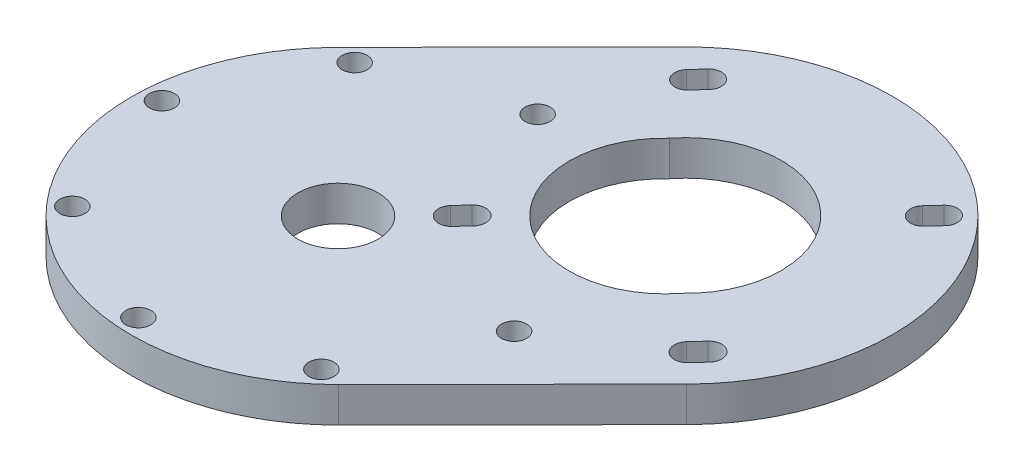
ISO-10303-21;
HEADER;
FILE_DESCRIPTION(('STEP AP214'),'2;1');
FILE_NAME('part.step','',(''),(''),'','','');
FILE_SCHEMA(('AUTOMOTIVE_DESIGN { 1 0 10303 214 1 1 1 1 }'));
ENDSEC;
DATA;
#1=APPLICATION_CONTEXT('core data for automotive mechanical design processes');
#2=APPLICATION_PROTOCOL_DEFINITION('international standard','automotive_design',2000,#1);
#3=PRODUCT_CONTEXT('',#1,'mechanical');
#4=PRODUCT('Part','Part','',(#3));
#5=PRODUCT_RELATED_PRODUCT_CATEGORY('part','',(#4));
#6=PRODUCT_DEFINITION_FORMATION('','',#4);
#7=PRODUCT_DEFINITION_CONTEXT('part definition',#1,'design');
#8=PRODUCT_DEFINITION('design','',#6,#7);
#9=PRODUCT_DEFINITION_SHAPE('','',#8);
#10=(LENGTH_UNIT() NAMED_UNIT(*) SI_UNIT(.MILLI.,.METRE.));
#11=(NAMED_UNIT(*) PLANE_ANGLE_UNIT() SI_UNIT($,.RADIAN.));
#12=(NAMED_UNIT(*) SI_UNIT($,.STERADIAN.) SOLID_ANGLE_UNIT());
#13=UNCERTAINTY_MEASURE_WITH_UNIT(LENGTH_MEASURE(1.E-05),#10,'distance_accuracy_value','');
#14=(GEOMETRIC_REPRESENTATION_CONTEXT(3) GLOBAL_UNCERTAINTY_ASSIGNED_CONTEXT((#13)) GLOBAL_UNIT_ASSIGNED_CONTEXT((#10,
#11,#12)) REPRESENTATION_CONTEXT('',''));
#15=CARTESIAN_POINT('',(0.,0.,0.));
#16=DIRECTION('',(0.,0.,1.));
#17=DIRECTION('',(1.,0.,0.));
#18=AXIS2_PLACEMENT_3D('',#15,#16,#17);
#19=CARTESIAN_POINT('',(48.6119055217946,7.,48.3782656438902));
#20=DIRECTION('',(-0.708808076030817,0.,-0.705401383152522));
#21=DIRECTION('',(-0.705401383152522,0.,0.708808076030817));
#22=AXIS2_PLACEMENT_3D('',#19,#20,#21);
#23=PLANE('',#22);
#24=DIRECTION('',(0.705401383152522,0.,-0.708808076030817));
#25=VECTOR('',#24,1.);
#26=CARTESIAN_POINT('',(48.6119055217946,0.,48.3782656438902));
#27=LINE('',#26,#25);
#28=CARTESIAN_POINT('',(57.4856721403524,0.,39.4616437116556));
#29=VERTEX_POINT('',#28);
#30=CARTESIAN_POINT('',(92.06950406204,0.,4.71079128685355));
#31=VERTEX_POINT('',#30);
#32=EDGE_CURVE('E308',#29,#31,#27,.T.);
#33=ORIENTED_EDGE('',*,*,#32,.T.);
#34=DIRECTION('',(0.,-1.,0.));
#35=VECTOR('',#34,1.);
#36=CARTESIAN_POINT('',(92.06950406204,7.,4.71079128685355));
#37=LINE('',#36,#35);
#38=CARTESIAN_POINT('',(92.06950406204,7.,4.71079128685355));
#39=VERTEX_POINT('',#38);
#40=EDGE_CURVE('E11',#39,#31,#37,.T.);
#41=ORIENTED_EDGE('',*,*,#40,.F.);
#42=DIRECTION('',(0.705401383152522,0.,-0.708808076030817));
#43=VECTOR('',#42,1.);
#44=CARTESIAN_POINT('',(48.6119055217946,7.,48.3782656438902));
#45=LINE('',#44,#43);
#46=CARTESIAN_POINT('',(57.4856721403524,7.,39.4616437116556));
#47=VERTEX_POINT('',#46);
#48=EDGE_CURVE('E210',#47,#39,#45,.T.);
#49=ORIENTED_EDGE('',*,*,#48,.F.);
#50=DIRECTION('',(0.,-1.,0.));
#51=VECTOR('',#50,1.);
#52=CARTESIAN_POINT('',(57.4856721403524,7.,39.4616437116556));
#53=LINE('',#52,#51);
#54=EDGE_CURVE('E320',#47,#29,#53,.T.);
#55=ORIENTED_EDGE('',*,*,#54,.T.);
#56=EDGE_LOOP('',(#33,#41,#49,#55));
#57=FACE_BOUND('',#56,.T.);
#58=ADVANCED_FACE('F47',(#57),#23,.F.);
#59=CARTESIAN_POINT('',(62.9088785904308,7.,-24.309681584242));
#60=DIRECTION('',(0.,-1.,0.));
#61=DIRECTION('',(0.,0.,-1.));
#62=AXIS2_PLACEMENT_3D('',#59,#60,#61);
#63=CYLINDRICAL_SURFACE('',#62,41.1403685393975);
#64=CARTESIAN_POINT('',(62.9088785904308,0.,-24.309681584242));
#65=DIRECTION('',(0.,1.,0.));
#66=DIRECTION('',(0.,0.,1.));
#67=AXIS2_PLACEMENT_3D('',#64,#65,#66);
#68=CIRCLE('',#67,41.1403685393975);
#69=CARTESIAN_POINT('',(33.7482531188217,0.,-53.3301544553374));
#70=VERTEX_POINT('',#69);
#71=EDGE_CURVE('E217',#31,#70,#68,.T.);
#72=ORIENTED_EDGE('',*,*,#71,.T.);
#73=DIRECTION('',(0.,-1.,0.));
#74=VECTOR('',#73,1.);
#75=CARTESIAN_POINT('',(33.7482531188217,7.,-53.3301544553374));
#76=LINE('',#75,#74);
#77=CARTESIAN_POINT('',(33.7482531188217,7.,-53.3301544553374));
#78=VERTEX_POINT('',#77);
#79=EDGE_CURVE('E58',#78,#70,#76,.T.);
#80=ORIENTED_EDGE('',*,*,#79,.F.);
#81=CARTESIAN_POINT('',(62.9088785904308,7.,-24.309681584242));
#82=DIRECTION('',(0.,1.,0.));
#83=DIRECTION('',(0.,0.,1.));
#84=AXIS2_PLACEMENT_3D('',#81,#82,#83);
#85=CIRCLE('',#84,41.1403685393975);
#86=EDGE_CURVE('E204',#39,#78,#85,.T.);
#87=ORIENTED_EDGE('',*,*,#86,.F.);
#88=ORIENTED_EDGE('',*,*,#40,.T.);
#89=EDGE_LOOP('',(#72,#80,#87,#88));
#90=FACE_BOUND('',#89,.T.);
#91=ADVANCED_FACE('F216',(#90),#63,.T.);
#92=CARTESIAN_POINT('',(-9.70934542142362,7.,-9.66268009830076));
#93=DIRECTION('',(-0.708808076030817,0.,-0.705401383152522));
#94=DIRECTION('',(-0.705401383152522,0.,0.708808076030817));
#95=AXIS2_PLACEMENT_3D('',#92,#93,#94);
#96=PLANE('',#95);
#97=DIRECTION('',(0.705401383152522,0.,-0.708808076030817));
#98=VECTOR('',#97,1.);
#99=CARTESIAN_POINT('',(-9.70934542142362,0.,-9.66268009830076));
#100=LINE('',#99,#98);
#101=CARTESIAN_POINT('',(-0.835578802865854,0.,-18.5793020305354));
#102=VERTEX_POINT('',#101);
#103=EDGE_CURVE('E314',#102,#70,#100,.T.);
#104=ORIENTED_EDGE('',*,*,#103,.F.);
#105=DIRECTION('',(0.,-1.,0.));
#106=VECTOR('',#105,1.);
#107=CARTESIAN_POINT('',(-0.835578802865854,7.,-18.5793020305354));
#108=LINE('',#107,#106);
#109=CARTESIAN_POINT('',(-0.835578802865854,7.,-18.5793020305354));
#110=VERTEX_POINT('',#109);
#111=EDGE_CURVE('E137',#110,#102,#108,.T.);
#112=ORIENTED_EDGE('',*,*,#111,.F.);
#113=DIRECTION('',(0.705401383152522,0.,-0.708808076030817));
#114=VECTOR('',#113,1.);
#115=CARTESIAN_POINT('',(-9.70934542142362,7.,-9.66268009830076));
#116=LINE('',#115,#114);
#117=EDGE_CURVE('E208',#110,#78,#116,.T.);
#118=ORIENTED_EDGE('',*,*,#117,.T.);
#119=ORIENTED_EDGE('',*,*,#79,.T.);
#120=EDGE_LOOP('',(#104,#112,#118,#119));
#121=FACE_BOUND('',#120,.T.);
#122=ADVANCED_FACE('F223',(#121),#96,.T.);
#123=CARTESIAN_POINT('',(88.6746138745272,7.,-3.08991515479181));
#124=DIRECTION('',(0.,-1.,0.));
#125=DIRECTION('',(0.,0.,-1.));
#126=AXIS2_PLACEMENT_3D('',#123,#124,#125);
#127=CYLINDRICAL_SURFACE('',#126,2.5667894621367);
#128=CARTESIAN_POINT('',(88.6746138745272,0.,-3.08991515479181));
#129=DIRECTION('',(0.,1.,0.));
#130=DIRECTION('',(0.,0.,1.));
#131=AXIS2_PLACEMENT_3D('',#128,#129,#130);
#132=CIRCLE('',#131,2.5667894621367);
#133=CARTESIAN_POINT('',(90.5681129916622,0.,-1.35697856150717));
#134=VERTEX_POINT('',#133);
#135=CARTESIAN_POINT('',(86.7811147573922,0.,-4.82285174807646));
#136=VERTEX_POINT('',#135);
#137=EDGE_CURVE('E288',#134,#136,#132,.T.);
#138=ORIENTED_EDGE('',*,*,#137,.F.);
#139=DIRECTION('',(0.,-1.,0.));
#140=VECTOR('',#139,1.);
#141=CARTESIAN_POINT('',(90.5681129916622,7.,-1.35697856150717));
#142=LINE('',#141,#140);
#143=CARTESIAN_POINT('',(90.5681129916622,7.,-1.35697856150717));
#144=VERTEX_POINT('',#143);
#145=EDGE_CURVE('E323',#144,#134,#142,.T.);
#146=ORIENTED_EDGE('',*,*,#145,.F.);
#147=CARTESIAN_POINT('',(88.6746138745272,7.,-3.08991515479181));
#148=DIRECTION('',(0.,1.,0.));
#149=DIRECTION('',(0.,0.,1.));
#150=AXIS2_PLACEMENT_3D('',#147,#148,#149);
#151=CIRCLE('',#150,2.5667894621367);
#152=CARTESIAN_POINT('',(86.7811147573922,7.,-4.82285174807646));
#153=VERTEX_POINT('',#152);
#154=EDGE_CURVE('E466',#144,#153,#151,.T.);
#155=ORIENTED_EDGE('',*,*,#154,.T.);
#156=DIRECTION('',(0.,-1.,0.));
#157=VECTOR('',#156,1.);
#158=CARTESIAN_POINT('',(86.7811147573922,7.,-4.82285174807646));
#159=LINE('',#158,#157);
#160=EDGE_CURVE('E326',#153,#136,#159,.T.);
#161=ORIENTED_EDGE('',*,*,#160,.T.);
#162=EDGE_LOOP('',(#138,#146,#155,#161));
#163=FACE_BOUND('',#162,.T.);
#164=ADVANCED_FACE('F531',(#163),#127,.F.);
#165=CARTESIAN_POINT('',(48.6103319085116,7.,44.4883349633829));
#166=DIRECTION('',(-0.737691635822276,0.,-0.675137801073125));
#167=DIRECTION('',(-0.675137801073125,0.,0.737691635822276));
#168=AXIS2_PLACEMENT_3D('',#165,#166,#167);
#169=PLANE('',#168);
#170=DIRECTION('',(0.675137801073125,0.,-0.737691635822276));
#171=VECTOR('',#170,1.);
#172=CARTESIAN_POINT('',(48.6103319085116,0.,44.4883349633829));
#173=LINE('',#172,#171);
#174=CARTESIAN_POINT('',(88.5224496687101,0.,0.878222490265534));
#175=VERTEX_POINT('',#174);
#176=EDGE_CURVE('E292',#175,#134,#173,.T.);
#177=ORIENTED_EDGE('',*,*,#176,.F.);
#178=DIRECTION('',(0.,-1.,0.));
#179=VECTOR('',#178,1.);
#180=CARTESIAN_POINT('',(88.5224496687101,7.,0.878222490265534));
#181=LINE('',#180,#179);
#182=CARTESIAN_POINT('',(88.5224496687101,7.,0.878222490265534));
#183=VERTEX_POINT('',#182);
#184=EDGE_CURVE('E333',#183,#175,#181,.T.);
#185=ORIENTED_EDGE('',*,*,#184,.F.);
#186=DIRECTION('',(0.675137801073125,0.,-0.737691635822276));
#187=VECTOR('',#186,1.);
#188=CARTESIAN_POINT('',(48.6103319085116,7.,44.4883349633829));
#189=LINE('',#188,#187);
#190=EDGE_CURVE('E470',#183,#144,#189,.T.);
#191=ORIENTED_EDGE('',*,*,#190,.T.);
#192=ORIENTED_EDGE('',*,*,#145,.T.);
#193=EDGE_LOOP('',(#177,#185,#191,#192));
#194=FACE_BOUND('',#193,.T.);
#195=ADVANCED_FACE('F527',(#194),#169,.T.);
#196=CARTESIAN_POINT('',(86.6289505515751,7.,-0.854714103019109));
#197=DIRECTION('',(0.,-1.,0.));
#198=DIRECTION('',(0.,0.,-1.));
#199=AXIS2_PLACEMENT_3D('',#196,#197,#198);
#200=CYLINDRICAL_SURFACE('',#199,2.5667894621367);
#201=CARTESIAN_POINT('',(86.6289505515751,0.,-0.854714103019109));
#202=DIRECTION('',(0.,1.,0.));
#203=DIRECTION('',(0.,0.,1.));
#204=AXIS2_PLACEMENT_3D('',#201,#202,#203);
#205=CIRCLE('',#204,2.5667894621367);
#206=CARTESIAN_POINT('',(84.7354514344401,0.,-2.58765069630375));
#207=VERTEX_POINT('',#206);
#208=EDGE_CURVE('E296',#207,#175,#205,.T.);
#209=ORIENTED_EDGE('',*,*,#208,.F.);
#210=DIRECTION('',(0.,-1.,0.));
#211=VECTOR('',#210,1.);
#212=CARTESIAN_POINT('',(84.7354514344401,7.,-2.58765069630375));
#213=LINE('',#212,#211);
#214=CARTESIAN_POINT('',(84.7354514344401,7.,-2.58765069630375));
#215=VERTEX_POINT('',#214);
#216=EDGE_CURVE('E329',#215,#207,#213,.T.);
#217=ORIENTED_EDGE('',*,*,#216,.F.);
#218=CARTESIAN_POINT('',(86.6289505515751,7.,-0.854714103019109));
#219=DIRECTION('',(0.,1.,0.));
#220=DIRECTION('',(0.,0.,1.));
#221=AXIS2_PLACEMENT_3D('',#218,#219,#220);
#222=CIRCLE('',#221,2.5667894621367);
#223=EDGE_CURVE('E474',#215,#183,#222,.T.);
#224=ORIENTED_EDGE('',*,*,#223,.T.);
#225=ORIENTED_EDGE('',*,*,#184,.T.);
#226=EDGE_LOOP('',(#209,#217,#224,#225));
#227=FACE_BOUND('',#226,.T.);
#228=ADVANCED_FACE('F523',(#227),#200,.F.);
#229=CARTESIAN_POINT('',(41.6746138747573,7.,-3.08991515485793));
#230=DIRECTION('',(0.,-1.,0.));
#231=DIRECTION('',(0.,0.,-1.));
#232=AXIS2_PLACEMENT_3D('',#229,#230,#231);
#233=CYLINDRICAL_SURFACE('',#232,2.55617789141967);
#234=CARTESIAN_POINT('',(41.6746138747573,0.,-3.08991515485793));
#235=DIRECTION('',(0.,1.,0.));
#236=DIRECTION('',(0.,0.,1.));
#237=AXIS2_PLACEMENT_3D('',#234,#235,#236);
#238=CIRCLE('',#237,2.55617789141967);
#239=CARTESIAN_POINT('',(43.5602849249314,0.,-1.36414283409311));
#240=VERTEX_POINT('',#239);
#241=CARTESIAN_POINT('',(39.7889428245832,0.,-4.81568747562275));
#242=VERTEX_POINT('',#241);
#243=EDGE_CURVE('E272',#240,#242,#238,.T.);
#244=ORIENTED_EDGE('',*,*,#243,.F.);
#245=DIRECTION('',(0.,-1.,0.));
#246=VECTOR('',#245,1.);
#247=CARTESIAN_POINT('',(43.5602849249314,7.,-1.36414283409311));
#248=LINE('',#247,#246);
#249=CARTESIAN_POINT('',(43.5602849249314,7.,-1.36414283409311));
#250=VERTEX_POINT('',#249);
#251=EDGE_CURVE('E330',#250,#240,#248,.T.);
#252=ORIENTED_EDGE('',*,*,#251,.F.);
#253=CARTESIAN_POINT('',(41.6746138747573,7.,-3.08991515485793));
#254=DIRECTION('',(0.,1.,0.));
#255=DIRECTION('',(0.,0.,1.));
#256=AXIS2_PLACEMENT_3D('',#253,#254,#255);
#257=CIRCLE('',#256,2.55617789141967);
#258=CARTESIAN_POINT('',(39.7889428245832,7.,-4.81568747562275));
#259=VERTEX_POINT('',#258);
#260=EDGE_CURVE('E451',#250,#259,#257,.T.);
#261=ORIENTED_EDGE('',*,*,#260,.T.);
#262=DIRECTION('',(0.,-1.,0.));
#263=VECTOR('',#262,1.);
#264=CARTESIAN_POINT('',(39.7889428245832,7.,-4.81568747562275));
#265=LINE('',#264,#263);
#266=EDGE_CURVE('E338',#259,#242,#265,.T.);
#267=ORIENTED_EDGE('',*,*,#266,.T.);
#268=EDGE_LOOP('',(#244,#252,#261,#267));
#269=FACE_BOUND('',#268,.T.);
#270=ADVANCED_FACE('F526',(#269),#233,.F.);
#271=CARTESIAN_POINT('',(23.0256232122219,7.,21.0731257736304));
#272=DIRECTION('',(-0.737691635822271,0.,-0.67513780107313));
#273=DIRECTION('',(-0.67513780107313,0.,0.737691635822271));
#274=AXIS2_PLACEMENT_3D('',#271,#272,#273);
#275=PLANE('',#274);
#276=DIRECTION('',(0.67513780107313,0.,-0.737691635822271));
#277=VECTOR('',#276,1.);
#278=CARTESIAN_POINT('',(23.0256232122219,0.,21.0731257736304));
#279=LINE('',#278,#277);
#280=CARTESIAN_POINT('',(41.5146216019793,0.,0.871058217679577));
#281=VERTEX_POINT('',#280);
#282=EDGE_CURVE('E276',#281,#240,#279,.T.);
#283=ORIENTED_EDGE('',*,*,#282,.F.);
#284=DIRECTION('',(0.,-1.,0.));
#285=VECTOR('',#284,1.);
#286=CARTESIAN_POINT('',(41.5146216019793,7.,0.871058217679577));
#287=LINE('',#286,#285);
#288=CARTESIAN_POINT('',(41.5146216019793,7.,0.871058217679577));
#289=VERTEX_POINT('',#288);
#290=EDGE_CURVE('E345',#289,#281,#287,.T.);
#291=ORIENTED_EDGE('',*,*,#290,.F.);
#292=DIRECTION('',(0.67513780107313,0.,-0.737691635822271));
#293=VECTOR('',#292,1.);
#294=CARTESIAN_POINT('',(23.0256232122219,7.,21.0731257736304));
#295=LINE('',#294,#293);
#296=EDGE_CURVE('E455',#289,#250,#295,.T.);
#297=ORIENTED_EDGE('',*,*,#296,.T.);
#298=ORIENTED_EDGE('',*,*,#251,.T.);
#299=EDGE_LOOP('',(#283,#291,#297,#298));
#300=FACE_BOUND('',#299,.T.);
#301=ADVANCED_FACE('F544',(#300),#275,.T.);
#302=CARTESIAN_POINT('',(39.6289505518052,7.,-0.854714103085248));
#303=DIRECTION('',(0.,-1.,0.));
#304=DIRECTION('',(0.,0.,-1.));
#305=AXIS2_PLACEMENT_3D('',#302,#303,#304);
#306=CYLINDRICAL_SURFACE('',#305,2.55617789141967);
#307=CARTESIAN_POINT('',(39.6289505518052,0.,-0.854714103085248));
#308=DIRECTION('',(0.,1.,0.));
#309=DIRECTION('',(0.,0.,1.));
#310=AXIS2_PLACEMENT_3D('',#307,#308,#309);
#311=CIRCLE('',#310,2.55617789141967);
#312=CARTESIAN_POINT('',(37.7432795016311,0.,-2.58048642385007));
#313=VERTEX_POINT('',#312);
#314=EDGE_CURVE('E280',#313,#281,#311,.T.);
#315=ORIENTED_EDGE('',*,*,#314,.F.);
#316=DIRECTION('',(0.,-1.,0.));
#317=VECTOR('',#316,1.);
#318=CARTESIAN_POINT('',(37.7432795016311,7.,-2.58048642385007));
#319=LINE('',#318,#317);
#320=CARTESIAN_POINT('',(37.7432795016311,7.,-2.58048642385007));
#321=VERTEX_POINT('',#320);
#322=EDGE_CURVE('E341',#321,#313,#319,.T.);
#323=ORIENTED_EDGE('',*,*,#322,.F.);
#324=CARTESIAN_POINT('',(39.6289505518052,7.,-0.854714103085248));
#325=DIRECTION('',(0.,1.,0.));
#326=DIRECTION('',(0.,0.,1.));
#327=AXIS2_PLACEMENT_3D('',#324,#325,#326);
#328=CIRCLE('',#327,2.55617789141967);
#329=EDGE_CURVE('E459',#321,#289,#328,.T.);
#330=ORIENTED_EDGE('',*,*,#329,.T.);
#331=ORIENTED_EDGE('',*,*,#290,.T.);
#332=EDGE_LOOP('',(#315,#323,#330,#331));
#333=FACE_BOUND('',#332,.T.);
#334=ADVANCED_FACE('F540',(#333),#306,.F.);
#335=CARTESIAN_POINT('',(88.6746138745272,7.,-50.0899151547897));
#336=DIRECTION('',(0.,-1.,0.));
#337=DIRECTION('',(0.,0.,-1.));
#338=AXIS2_PLACEMENT_3D('',#335,#336,#337);
#339=CYLINDRICAL_SURFACE('',#338,2.50056016352759);
#340=CARTESIAN_POINT('',(88.6746138745272,0.,-50.0899151547897));
#341=DIRECTION('',(0.,1.,0.));
#342=DIRECTION('',(0.,0.,1.));
#343=AXIS2_PLACEMENT_3D('',#340,#341,#342);
#344=CIRCLE('',#343,2.50056016352759);
#345=CARTESIAN_POINT('',(90.5192561920319,0.,-48.4016924645346));
#346=VERTEX_POINT('',#345);
#347=CARTESIAN_POINT('',(86.8299715570225,0.,-51.7781378450447));
#348=VERTEX_POINT('',#347);
#349=EDGE_CURVE('E256',#346,#348,#344,.T.);
#350=ORIENTED_EDGE('',*,*,#349,.F.);
#351=DIRECTION('',(0.,-1.,0.));
#352=VECTOR('',#351,1.);
#353=CARTESIAN_POINT('',(90.5192561920319,7.,-48.4016924645346));
#354=LINE('',#353,#352);
#355=CARTESIAN_POINT('',(90.5192561920319,7.,-48.4016924645346));
#356=VERTEX_POINT('',#355);
#357=EDGE_CURVE('E342',#356,#346,#354,.T.);
#358=ORIENTED_EDGE('',*,*,#357,.F.);
#359=CARTESIAN_POINT('',(88.6746138745272,7.,-50.0899151547897));
#360=DIRECTION('',(0.,1.,0.));
#361=DIRECTION('',(0.,0.,1.));
#362=AXIS2_PLACEMENT_3D('',#359,#360,#361);
#363=CIRCLE('',#362,2.50056016352759);
#364=CARTESIAN_POINT('',(86.8299715570225,7.,-51.7781378450447));
#365=VERTEX_POINT('',#364);
#366=EDGE_CURVE('E436',#356,#365,#363,.T.);
#367=ORIENTED_EDGE('',*,*,#366,.T.);
#368=DIRECTION('',(0.,-1.,0.));
#369=VECTOR('',#368,1.);
#370=CARTESIAN_POINT('',(86.8299715570225,7.,-51.7781378450447));
#371=LINE('',#370,#369);
#372=EDGE_CURVE('E350',#365,#348,#371,.T.);
#373=ORIENTED_EDGE('',*,*,#372,.T.);
#374=EDGE_LOOP('',(#350,#358,#367,#373));
#375=FACE_BOUND('',#374,.T.);
#376=ADVANCED_FACE('F543',(#375),#339,.F.);
#377=CARTESIAN_POINT('',(25.153430191565,7.,23.0205016897751));
#378=DIRECTION('',(-0.737691635822274,0.,-0.675137801073127));
#379=DIRECTION('',(-0.675137801073127,0.,0.737691635822275));
#380=AXIS2_PLACEMENT_3D('',#377,#378,#379);
#381=PLANE('',#380);
#382=DIRECTION('',(0.675137801073127,0.,-0.737691635822275));
#383=VECTOR('',#382,1.);
#384=CARTESIAN_POINT('',(25.153430191565,0.,23.0205016897751));
#385=LINE('',#384,#383);
#386=CARTESIAN_POINT('',(88.4735928690798,0.,-46.1664914127619));
#387=VERTEX_POINT('',#386);
#388=EDGE_CURVE('E260',#387,#346,#385,.T.);
#389=ORIENTED_EDGE('',*,*,#388,.F.);
#390=DIRECTION('',(0.,-1.,0.));
#391=VECTOR('',#390,1.);
#392=CARTESIAN_POINT('',(88.4735928690798,7.,-46.1664914127619));
#393=LINE('',#392,#391);
#394=CARTESIAN_POINT('',(88.4735928690798,7.,-46.1664914127619));
#395=VERTEX_POINT('',#394);
#396=EDGE_CURVE('E357',#395,#387,#393,.T.);
#397=ORIENTED_EDGE('',*,*,#396,.F.);
#398=DIRECTION('',(0.675137801073127,0.,-0.737691635822275));
#399=VECTOR('',#398,1.);
#400=CARTESIAN_POINT('',(25.153430191565,7.,23.0205016897751));
#401=LINE('',#400,#399);
#402=EDGE_CURVE('E440',#395,#356,#401,.T.);
#403=ORIENTED_EDGE('',*,*,#402,.T.);
#404=ORIENTED_EDGE('',*,*,#357,.T.);
#405=EDGE_LOOP('',(#389,#397,#403,#404));
#406=FACE_BOUND('',#405,.T.);
#407=ADVANCED_FACE('F560',(#406),#381,.T.);
#408=CARTESIAN_POINT('',(86.6289505515751,7.,-47.854714103017));
#409=DIRECTION('',(0.,-1.,0.));
#410=DIRECTION('',(0.,0.,-1.));
#411=AXIS2_PLACEMENT_3D('',#408,#409,#410);
#412=CYLINDRICAL_SURFACE('',#411,2.50056016352759);
#413=CARTESIAN_POINT('',(86.6289505515751,0.,-47.854714103017));
#414=DIRECTION('',(0.,1.,0.));
#415=DIRECTION('',(0.,0.,1.));
#416=AXIS2_PLACEMENT_3D('',#413,#414,#415);
#417=CIRCLE('',#416,2.50056016352759);
#418=CARTESIAN_POINT('',(84.7843082340704,0.,-49.542936793272));
#419=VERTEX_POINT('',#418);
#420=EDGE_CURVE('E264',#419,#387,#417,.T.);
#421=ORIENTED_EDGE('',*,*,#420,.F.);
#422=DIRECTION('',(0.,-1.,0.));
#423=VECTOR('',#422,1.);
#424=CARTESIAN_POINT('',(84.7843082340704,7.,-49.542936793272));
#425=LINE('',#424,#423);
#426=CARTESIAN_POINT('',(84.7843082340704,7.,-49.542936793272));
#427=VERTEX_POINT('',#426);
#428=EDGE_CURVE('E353',#427,#419,#425,.T.);
#429=ORIENTED_EDGE('',*,*,#428,.F.);
#430=CARTESIAN_POINT('',(86.6289505515751,7.,-47.854714103017));
#431=DIRECTION('',(0.,1.,0.));
#432=DIRECTION('',(0.,0.,1.));
#433=AXIS2_PLACEMENT_3D('',#430,#431,#432);
#434=CIRCLE('',#433,2.50056016352759);
#435=EDGE_CURVE('E444',#427,#395,#434,.T.);
#436=ORIENTED_EDGE('',*,*,#435,.T.);
#437=ORIENTED_EDGE('',*,*,#396,.T.);
#438=EDGE_LOOP('',(#421,#429,#436,#437));
#439=FACE_BOUND('',#438,.T.);
#440=ADVANCED_FACE('F556',(#439),#412,.F.);
#441=CARTESIAN_POINT('',(41.6746138745294,7.,-50.0899151547897));
#442=DIRECTION('',(0.,-1.,0.));
#443=DIRECTION('',(0.,0.,-1.));
#444=AXIS2_PLACEMENT_3D('',#441,#442,#443);
#445=CYLINDRICAL_SURFACE('',#444,2.50386212422869);
#446=CARTESIAN_POINT('',(41.6746138745294,0.,-50.0899151547897));
#447=DIRECTION('',(0.,1.,0.));
#448=DIRECTION('',(0.,0.,1.));
#449=AXIS2_PLACEMENT_3D('',#446,#447,#448);
#450=CIRCLE('',#449,2.50386212422869);
#451=CARTESIAN_POINT('',(43.5216920208251,0.,-48.3994631860476));
#452=VERTEX_POINT('',#451);
#453=CARTESIAN_POINT('',(39.8275357282337,0.,-51.7803671235317));
#454=VERTEX_POINT('',#453);
#455=EDGE_CURVE('E240',#452,#454,#450,.T.);
#456=ORIENTED_EDGE('',*,*,#455,.F.);
#457=DIRECTION('',(0.,-1.,0.));
#458=VECTOR('',#457,1.);
#459=CARTESIAN_POINT('',(43.5216920208251,7.,-48.3994631860476));
#460=LINE('',#459,#458);
#461=CARTESIAN_POINT('',(43.5216920208251,7.,-48.3994631860476));
#462=VERTEX_POINT('',#461);
#463=EDGE_CURVE('E354',#462,#452,#460,.T.);
#464=ORIENTED_EDGE('',*,*,#463,.F.);
#465=CARTESIAN_POINT('',(41.6746138745294,7.,-50.0899151547897));
#466=DIRECTION('',(0.,1.,0.));
#467=DIRECTION('',(0.,0.,1.));
#468=AXIS2_PLACEMENT_3D('',#465,#466,#467);
#469=CIRCLE('',#468,2.50386212422869);
#470=CARTESIAN_POINT('',(39.8275357282337,7.,-51.7803671235317));
#471=VERTEX_POINT('',#470);
#472=EDGE_CURVE('E421',#462,#471,#469,.T.);
#473=ORIENTED_EDGE('',*,*,#472,.T.);
#474=DIRECTION('',(0.,-1.,0.));
#475=VECTOR('',#474,1.);
#476=CARTESIAN_POINT('',(39.8275357282337,7.,-51.7803671235317));
#477=LINE('',#476,#475);
#478=EDGE_CURVE('E362',#471,#454,#477,.T.);
#479=ORIENTED_EDGE('',*,*,#478,.T.);
#480=EDGE_LOOP('',(#456,#464,#473,#479));
#481=FACE_BOUND('',#480,.T.);
#482=ADVANCED_FACE('F559',(#481),#445,.F.);
#483=CARTESIAN_POINT('',(-0.421014609063499,7.,-0.385313949054009));
#484=DIRECTION('',(-0.737691635822274,0.,-0.675137801073127));
#485=DIRECTION('',(-0.675137801073127,0.,0.737691635822275));
#486=AXIS2_PLACEMENT_3D('',#483,#484,#485);
#487=PLANE('',#486);
#488=DIRECTION('',(0.675137801073127,0.,-0.737691635822275));
#489=VECTOR('',#488,1.);
#490=CARTESIAN_POINT('',(-0.421014609063499,0.,-0.385313949054009));
#491=LINE('',#490,#489);
#492=CARTESIAN_POINT('',(41.476028697873,0.,-46.1642621342749));
#493=VERTEX_POINT('',#492);
#494=EDGE_CURVE('E244',#493,#452,#491,.T.);
#495=ORIENTED_EDGE('',*,*,#494,.F.);
#496=DIRECTION('',(0.,-1.,0.));
#497=VECTOR('',#496,1.);
#498=CARTESIAN_POINT('',(41.476028697873,7.,-46.1642621342749));
#499=LINE('',#498,#497);
#500=CARTESIAN_POINT('',(41.476028697873,7.,-46.1642621342749));
#501=VERTEX_POINT('',#500);
#502=EDGE_CURVE('E368',#501,#493,#499,.T.);
#503=ORIENTED_EDGE('',*,*,#502,.F.);
#504=DIRECTION('',(0.675137801073127,0.,-0.737691635822275));
#505=VECTOR('',#504,1.);
#506=CARTESIAN_POINT('',(-0.421014609063499,7.,-0.385313949054009));
#507=LINE('',#506,#505);
#508=EDGE_CURVE('E425',#501,#462,#507,.T.);
#509=ORIENTED_EDGE('',*,*,#508,.T.);
#510=ORIENTED_EDGE('',*,*,#463,.T.);
#511=EDGE_LOOP('',(#495,#503,#509,#510));
#512=FACE_BOUND('',#511,.T.);
#513=ADVANCED_FACE('F574',(#512),#487,.T.);
#514=CARTESIAN_POINT('',(39.6289505515773,7.,-47.854714103017));
#515=DIRECTION('',(0.,-1.,0.));
#516=DIRECTION('',(0.,0.,-1.));
#517=AXIS2_PLACEMENT_3D('',#514,#515,#516);
#518=CYLINDRICAL_SURFACE('',#517,2.50386212422869);
#519=CARTESIAN_POINT('',(39.6289505515773,0.,-47.854714103017));
#520=DIRECTION('',(0.,1.,0.));
#521=DIRECTION('',(0.,0.,1.));
#522=AXIS2_PLACEMENT_3D('',#519,#520,#521);
#523=CIRCLE('',#522,2.50386212422869);
#524=CARTESIAN_POINT('',(37.7818724052816,0.,-49.545166071759));
#525=VERTEX_POINT('',#524);
#526=EDGE_CURVE('E248',#525,#493,#523,.T.);
#527=ORIENTED_EDGE('',*,*,#526,.F.);
#528=DIRECTION('',(0.,-1.,0.));
#529=VECTOR('',#528,1.);
#530=CARTESIAN_POINT('',(37.7818724052816,7.,-49.545166071759));
#531=LINE('',#530,#529);
#532=CARTESIAN_POINT('',(37.7818724052816,7.,-49.545166071759));
#533=VERTEX_POINT('',#532);
#534=EDGE_CURVE('E365',#533,#525,#531,.T.);
#535=ORIENTED_EDGE('',*,*,#534,.F.);
#536=CARTESIAN_POINT('',(39.6289505515773,7.,-47.854714103017));
#537=DIRECTION('',(0.,1.,0.));
#538=DIRECTION('',(0.,0.,1.));
#539=AXIS2_PLACEMENT_3D('',#536,#537,#538);
#540=CIRCLE('',#539,2.50386212422869);
#541=EDGE_CURVE('E429',#533,#501,#540,.T.);
#542=ORIENTED_EDGE('',*,*,#541,.T.);
#543=ORIENTED_EDGE('',*,*,#502,.T.);
#544=EDGE_LOOP('',(#527,#535,#542,#543));
#545=FACE_BOUND('',#544,.T.);
#546=ADVANCED_FACE('F571',(#545),#518,.F.);
#547=CARTESIAN_POINT('',(62.9088785904308,7.,-24.309681584242));
#548=DIRECTION('',(0.,-1.,0.));
#549=DIRECTION('',(0.,0.,-1.));
#550=AXIS2_PLACEMENT_3D('',#547,#548,#549);
#551=CYLINDRICAL_SURFACE('',#550,19.);
#552=CARTESIAN_POINT('',(62.9088785904308,0.,-24.309681584242));
#553=DIRECTION('',(0.,1.,0.));
#554=DIRECTION('',(0.,0.,1.));
#555=AXIS2_PLACEMENT_3D('',#552,#553,#554);
#556=CIRCLE('',#555,19.);
#557=CARTESIAN_POINT('',(75.8575600845322,0.,-10.4053064611263));
#558=VERTEX_POINT('',#557);
#559=CARTESIAN_POINT('',(47.9145337733774,0.,-35.9788556555849));
#560=VERTEX_POINT('',#559);
#561=EDGE_CURVE('E231',#558,#560,#556,.T.);
#562=ORIENTED_EDGE('',*,*,#561,.F.);
#563=DIRECTION('',(0.,-1.,0.));
#564=VECTOR('',#563,1.);
#565=CARTESIAN_POINT('',(75.8575600845322,7.,-10.4053064611263));
#566=LINE('',#565,#564);
#567=CARTESIAN_POINT('',(75.8575600845322,7.,-10.4053064611263));
#568=VERTEX_POINT('',#567);
#569=EDGE_CURVE('E148',#568,#558,#566,.T.);
#570=ORIENTED_EDGE('',*,*,#569,.F.);
#571=CARTESIAN_POINT('',(62.9088785904308,7.,-24.309681584242));
#572=DIRECTION('',(0.,1.,0.));
#573=DIRECTION('',(0.,0.,1.));
#574=AXIS2_PLACEMENT_3D('',#571,#572,#573);
#575=CIRCLE('',#574,19.);
#576=CARTESIAN_POINT('',(47.9145337733774,7.,-35.9788556555849));
#577=VERTEX_POINT('',#576);
#578=EDGE_CURVE('E319',#568,#577,#575,.T.);
#579=ORIENTED_EDGE('',*,*,#578,.T.);
#580=DIRECTION('',(0.,-1.,0.));
#581=VECTOR('',#580,1.);
#582=CARTESIAN_POINT('',(47.9145337733774,7.,-35.9788556555849));
#583=LINE('',#582,#581);
#584=EDGE_CURVE('E227',#577,#560,#583,.T.);
#585=ORIENTED_EDGE('',*,*,#584,.T.);
#586=EDGE_LOOP('',(#562,#570,#579,#585));
#587=FACE_BOUND('',#586,.T.);
#588=ADVANCED_FACE('F49',(#587),#551,.F.);
#589=CARTESIAN_POINT('',(28.3250466687433,7.,10.4411708405601));
#590=DIRECTION('',(0.,-1.,0.));
#591=DIRECTION('',(0.,0.,-1.));
#592=AXIS2_PLACEMENT_3D('',#589,#590,#591);
#593=CYLINDRICAL_SURFACE('',#592,7.99999999999999);
#594=CARTESIAN_POINT('',(28.3250466687433,7.,10.4411708405601));
#595=DIRECTION('',(0.,1.,0.));
#596=DIRECTION('',(0.,0.,1.));
#597=AXIS2_PLACEMENT_3D('',#594,#595,#596);
#598=CIRCLE('',#597,7.99999999999999);
#599=CARTESIAN_POINT('',(28.3250466687433,7.,18.4411708405601));
#600=VERTEX_POINT('',#599);
#601=EDGE_CURVE('E481',#600,#600,#598,.T.);
#602=ORIENTED_EDGE('',*,*,#601,.T.);
#603=EDGE_LOOP('',(#602));
#604=FACE_BOUND('',#603,.T.);
#605=CARTESIAN_POINT('',(28.3250466687433,0.,10.4411708405601));
#606=DIRECTION('',(0.,1.,0.));
#607=DIRECTION('',(0.,0.,1.));
#608=AXIS2_PLACEMENT_3D('',#605,#606,#607);
#609=CIRCLE('',#608,7.99999999999999);
#610=CARTESIAN_POINT('',(28.3250466687433,0.,18.4411708405601));
#611=VERTEX_POINT('',#610);
#612=EDGE_CURVE('E304',#611,#611,#609,.T.);
#613=ORIENTED_EDGE('',*,*,#612,.F.);
#614=EDGE_LOOP('',(#613));
#615=FACE_BOUND('',#614,.T.);
#616=ADVANCED_FACE('F487',(#604,#615),#593,.F.);
#617=CARTESIAN_POINT('',(44.8233336742416,7.,41.0224617768136));
#618=DIRECTION('',(-0.737691635822276,0.,-0.675137801073125));
#619=DIRECTION('',(-0.675137801073125,0.,0.737691635822276));
#620=AXIS2_PLACEMENT_3D('',#617,#618,#619);
#621=PLANE('',#620);
#622=DIRECTION('',(0.675137801073125,0.,-0.737691635822276));
#623=VECTOR('',#622,1.);
#624=CARTESIAN_POINT('',(44.8233336742416,0.,41.0224617768136));
#625=LINE('',#624,#623);
#626=EDGE_CURVE('E300',#207,#136,#625,.T.);
#627=ORIENTED_EDGE('',*,*,#626,.T.);
#628=ORIENTED_EDGE('',*,*,#160,.F.);
#629=DIRECTION('',(0.675137801073125,0.,-0.737691635822276));
#630=VECTOR('',#629,1.);
#631=CARTESIAN_POINT('',(44.8233336742416,7.,41.0224617768136));
#632=LINE('',#631,#630);
#633=EDGE_CURVE('E478',#215,#153,#632,.T.);
#634=ORIENTED_EDGE('',*,*,#633,.F.);
#635=ORIENTED_EDGE('',*,*,#216,.T.);
#636=EDGE_LOOP('',(#627,#628,#634,#635));
#637=FACE_BOUND('',#636,.T.);
#638=ADVANCED_FACE('F518',(#637),#621,.F.);
#639=CARTESIAN_POINT('',(19.2542811118737,7.,17.6215811321008));
#640=DIRECTION('',(-0.737691635822271,0.,-0.67513780107313));
#641=DIRECTION('',(-0.67513780107313,0.,0.737691635822271));
#642=AXIS2_PLACEMENT_3D('',#639,#640,#641);
#643=PLANE('',#642);
#644=DIRECTION('',(0.67513780107313,0.,-0.737691635822271));
#645=VECTOR('',#644,1.);
#646=CARTESIAN_POINT('',(19.2542811118737,0.,17.6215811321008));
#647=LINE('',#646,#645);
#648=EDGE_CURVE('E284',#313,#242,#647,.T.);
#649=ORIENTED_EDGE('',*,*,#648,.T.);
#650=ORIENTED_EDGE('',*,*,#266,.F.);
#651=DIRECTION('',(0.67513780107313,0.,-0.737691635822271));
#652=VECTOR('',#651,1.);
#653=CARTESIAN_POINT('',(19.2542811118737,7.,17.6215811321008));
#654=LINE('',#653,#652);
#655=EDGE_CURVE('E463',#321,#259,#654,.T.);
#656=ORIENTED_EDGE('',*,*,#655,.F.);
#657=ORIENTED_EDGE('',*,*,#322,.T.);
#658=EDGE_LOOP('',(#649,#650,#656,#657));
#659=FACE_BOUND('',#658,.T.);
#660=ADVANCED_FACE('F521',(#659),#643,.F.);
#661=CARTESIAN_POINT('',(21.4641455565557,7.,19.6440563092649));
#662=DIRECTION('',(-0.737691635822274,0.,-0.675137801073127));
#663=DIRECTION('',(-0.675137801073127,0.,0.737691635822275));
#664=AXIS2_PLACEMENT_3D('',#661,#662,#663);
#665=PLANE('',#664);
#666=DIRECTION('',(0.675137801073127,0.,-0.737691635822275));
#667=VECTOR('',#666,1.);
#668=CARTESIAN_POINT('',(21.4641455565557,0.,19.6440563092649));
#669=LINE('',#668,#667);
#670=EDGE_CURVE('E268',#419,#348,#669,.T.);
#671=ORIENTED_EDGE('',*,*,#670,.T.);
#672=ORIENTED_EDGE('',*,*,#372,.F.);
#673=DIRECTION('',(0.675137801073127,0.,-0.737691635822275));
#674=VECTOR('',#673,1.);
#675=CARTESIAN_POINT('',(21.4641455565557,7.,19.6440563092649));
#676=LINE('',#675,#674);
#677=EDGE_CURVE('E448',#427,#365,#676,.T.);
#678=ORIENTED_EDGE('',*,*,#677,.F.);
#679=ORIENTED_EDGE('',*,*,#428,.T.);
#680=EDGE_LOOP('',(#671,#672,#678,#679));
#681=FACE_BOUND('',#680,.T.);
#682=ADVANCED_FACE('F538',(#681),#665,.F.);
#683=CARTESIAN_POINT('',(-4.1151709016549,7.,-3.7662178865381));
#684=DIRECTION('',(-0.737691635822274,0.,-0.675137801073127));
#685=DIRECTION('',(-0.675137801073127,0.,0.737691635822275));
#686=AXIS2_PLACEMENT_3D('',#683,#684,#685);
#687=PLANE('',#686);
#688=DIRECTION('',(0.675137801073127,0.,-0.737691635822275));
#689=VECTOR('',#688,1.);
#690=CARTESIAN_POINT('',(-4.1151709016549,0.,-3.7662178865381));
#691=LINE('',#690,#689);
#692=EDGE_CURVE('E252',#525,#454,#691,.T.);
#693=ORIENTED_EDGE('',*,*,#692,.T.);
#694=ORIENTED_EDGE('',*,*,#478,.F.);
#695=DIRECTION('',(0.675137801073127,0.,-0.737691635822275));
#696=VECTOR('',#695,1.);
#697=CARTESIAN_POINT('',(-4.1151709016549,7.,-3.7662178865381));
#698=LINE('',#697,#696);
#699=EDGE_CURVE('E433',#533,#471,#698,.T.);
#700=ORIENTED_EDGE('',*,*,#699,.F.);
#701=ORIENTED_EDGE('',*,*,#534,.T.);
#702=EDGE_LOOP('',(#693,#694,#700,#701));
#703=FACE_BOUND('',#702,.T.);
#704=ADVANCED_FACE('F554',(#703),#687,.F.);
#705=CARTESIAN_POINT('',(60.8632152674787,7.,-22.0744805324693));
#706=DIRECTION('',(0.,-1.,0.));
#707=DIRECTION('',(0.,0.,-1.));
#708=AXIS2_PLACEMENT_3D('',#705,#706,#707);
#709=CYLINDRICAL_SURFACE('',#708,19.);
#710=CARTESIAN_POINT('',(60.8632152674787,0.,-22.0744805324693));
#711=DIRECTION('',(0.,1.,0.));
#712=DIRECTION('',(0.,0.,1.));
#713=AXIS2_PLACEMENT_3D('',#710,#711,#712);
#714=CIRCLE('',#713,19.);
#715=EDGE_CURVE('E235',#560,#558,#714,.T.);
#716=ORIENTED_EDGE('',*,*,#715,.F.);
#717=ORIENTED_EDGE('',*,*,#584,.F.);
#718=CARTESIAN_POINT('',(60.8632152674787,7.,-22.0744805324693));
#719=DIRECTION('',(0.,1.,0.));
#720=DIRECTION('',(0.,0.,1.));
#721=AXIS2_PLACEMENT_3D('',#718,#719,#720);
#722=CIRCLE('',#721,19.);
#723=EDGE_CURVE('E417',#577,#568,#722,.T.);
#724=ORIENTED_EDGE('',*,*,#723,.T.);
#725=ORIENTED_EDGE('',*,*,#569,.T.);
#726=EDGE_LOOP('',(#716,#717,#724,#725));
#727=FACE_BOUND('',#726,.T.);
#728=ADVANCED_FACE('F502',(#727),#709,.F.);
#729=CARTESIAN_POINT('',(28.3250466687433,7.,10.4411708405601));
#730=DIRECTION('',(0.,-1.,0.));
#731=DIRECTION('',(0.,0.,-1.));
#732=AXIS2_PLACEMENT_3D('',#729,#730,#731);
#733=CYLINDRICAL_SURFACE('',#732,41.1403685393975);
#734=CARTESIAN_POINT('',(28.3250466687433,0.,10.4411708405601));
#735=DIRECTION('',(0.,1.,0.));
#736=DIRECTION('',(0.,0.,1.));
#737=AXIS2_PLACEMENT_3D('',#734,#735,#736);
#738=CIRCLE('',#737,41.1403685393975);
#739=EDGE_CURVE('E140',#102,#29,#738,.T.);
#740=ORIENTED_EDGE('',*,*,#739,.T.);
#741=ORIENTED_EDGE('',*,*,#54,.F.);
#742=CARTESIAN_POINT('',(28.3250466687433,7.,10.4411708405601));
#743=DIRECTION('',(0.,1.,0.));
#744=DIRECTION('',(0.,0.,1.));
#745=AXIS2_PLACEMENT_3D('',#742,#743,#744);
#746=CIRCLE('',#745,41.1403685393975);
#747=EDGE_CURVE('E67',#110,#47,#746,.T.);
#748=ORIENTED_EDGE('',*,*,#747,.F.);
#749=ORIENTED_EDGE('',*,*,#111,.T.);
#750=EDGE_LOOP('',(#740,#741,#748,#749));
#751=FACE_BOUND('',#750,.T.);
#752=ADVANCED_FACE('F492',(#751),#733,.T.);
#753=CARTESIAN_POINT('',(0.,7.,0.));
#754=DIRECTION('',(0.,1.,0.));
#755=DIRECTION('',(0.,0.,1.));
#756=AXIS2_PLACEMENT_3D('',#753,#754,#755);
#757=PLANE('',#756);
#758=CARTESIAN_POINT('',(-9.10168790362791,7.,8.09819426165969));
#759=DIRECTION('',(0.,1.,0.));
#760=DIRECTION('',(0.707106781186549,0.,0.707106781186546));
#761=AXIS2_PLACEMENT_3D('',#758,#759,#760);
#762=CIRCLE('',#761,2.5);
#763=CARTESIAN_POINT('',(-7.33392095066154,7.,9.86596121462606));
#764=VERTEX_POINT('',#763);
#765=EDGE_CURVE('E386',#764,#764,#762,.T.);
#766=ORIENTED_EDGE('',*,*,#765,.F.);
#767=EDGE_LOOP('',(#766));
#768=FACE_BOUND('',#767,.T.);
#769=CARTESIAN_POINT('',(0.203614227848911,7.,35.2491340272511));
#770=DIRECTION('',(0.,1.,0.));
#771=DIRECTION('',(1.,0.,0.));
#772=AXIS2_PLACEMENT_3D('',#769,#770,#771);
#773=CIRCLE('',#772,2.5);
#774=CARTESIAN_POINT('',(2.70361422784891,7.,35.2491340272511));
#775=VERTEX_POINT('',#774);
#776=EDGE_CURVE('E760',#775,#775,#773,.T.);
#777=ORIENTED_EDGE('',*,*,#776,.F.);
#778=EDGE_LOOP('',(#777));
#779=FACE_BOUND('',#778,.T.);
#780=CARTESIAN_POINT('',(25.982070089843,7.,47.8679054129313));
#781=DIRECTION('',(0.,1.,0.));
#782=DIRECTION('',(0.707106781186544,0.,-0.707106781186551));
#783=AXIS2_PLACEMENT_3D('',#780,#781,#782);
#784=CIRCLE('',#783,2.5);
#785=CARTESIAN_POINT('',(27.7498370428093,7.,46.1001384599649));
#786=VERTEX_POINT('',#785);
#787=EDGE_CURVE('E764',#786,#786,#784,.T.);
#788=ORIENTED_EDGE('',*,*,#787,.F.);
#789=EDGE_LOOP('',(#788));
#790=FACE_BOUND('',#789,.T.);
#791=CARTESIAN_POINT('',(53.1330098554341,7.,38.5626032814545));
#792=DIRECTION('',(0.,1.,0.));
#793=DIRECTION('',(0.,0.,-1.));
#794=AXIS2_PLACEMENT_3D('',#791,#792,#793);
#795=CIRCLE('',#794,2.5);
#796=CARTESIAN_POINT('',(53.1330098554341,7.,36.0626032814545));
#797=VERTEX_POINT('',#796);
#798=EDGE_CURVE('E770',#797,#797,#795,.T.);
#799=ORIENTED_EDGE('',*,*,#798,.F.);
#800=EDGE_LOOP('',(#799));
#801=FACE_BOUND('',#800,.T.);
#802=CARTESIAN_POINT('',(65.7517812411145,7.,12.7841474194602));
#803=DIRECTION('',(0.,1.,0.));
#804=DIRECTION('',(-0.707106781186554,0.,-0.707106781186541));
#805=AXIS2_PLACEMENT_3D('',#802,#803,#804);
#806=CIRCLE('',#805,2.5);
#807=CARTESIAN_POINT('',(63.9840142881481,7.,11.0163804664939));
#808=VERTEX_POINT('',#807);
#809=EDGE_CURVE('E773',#808,#808,#806,.T.);
#810=ORIENTED_EDGE('',*,*,#809,.F.);
#811=EDGE_LOOP('',(#810));
#812=FACE_BOUND('',#811,.T.);
#813=CARTESIAN_POINT('',(30.6680232476433,7.,-26.9855637318111));
#814=DIRECTION('',(0.,1.,0.));
#815=DIRECTION('',(-0.707106781186539,0.,0.707106781186556));
#816=AXIS2_PLACEMENT_3D('',#813,#814,#815);
#817=CIRCLE('',#816,2.5);
#818=CARTESIAN_POINT('',(28.9002562946769,7.,-25.2177967788447));
#819=VERTEX_POINT('',#818);
#820=EDGE_CURVE('E413',#819,#819,#817,.T.);
#821=ORIENTED_EDGE('',*,*,#820,.F.);
#822=EDGE_LOOP('',(#821));
#823=FACE_BOUND('',#822,.T.);
#824=CARTESIAN_POINT('',(3.51708348205239,7.,-17.6802616003343));
#825=DIRECTION('',(0.,1.,0.));
#826=DIRECTION('',(0.,0.,1.));
#827=AXIS2_PLACEMENT_3D('',#824,#825,#826);
#828=CIRCLE('',#827,2.5);
#829=CARTESIAN_POINT('',(3.51708348205239,7.,-15.1802616003343));
#830=VERTEX_POINT('',#829);
#831=EDGE_CURVE('E380',#830,#830,#828,.T.);
#832=ORIENTED_EDGE('',*,*,#831,.F.);
#833=EDGE_LOOP('',(#832));
#834=FACE_BOUND('',#833,.T.);
#835=ORIENTED_EDGE('',*,*,#578,.F.);
#836=ORIENTED_EDGE('',*,*,#723,.F.);
#837=EDGE_LOOP('',(#835,#836));
#838=FACE_BOUND('',#837,.T.);
#839=ORIENTED_EDGE('',*,*,#472,.F.);
#840=ORIENTED_EDGE('',*,*,#508,.F.);
#841=ORIENTED_EDGE('',*,*,#541,.F.);
#842=ORIENTED_EDGE('',*,*,#699,.T.);
#843=EDGE_LOOP('',(#839,#840,#841,#842));
#844=FACE_BOUND('',#843,.T.);
#845=ORIENTED_EDGE('',*,*,#366,.F.);
#846=ORIENTED_EDGE('',*,*,#402,.F.);
#847=ORIENTED_EDGE('',*,*,#435,.F.);
#848=ORIENTED_EDGE('',*,*,#677,.T.);
#849=EDGE_LOOP('',(#845,#846,#847,#848));
#850=FACE_BOUND('',#849,.T.);
#851=ORIENTED_EDGE('',*,*,#260,.F.);
#852=ORIENTED_EDGE('',*,*,#296,.F.);
#853=ORIENTED_EDGE('',*,*,#329,.F.);
#854=ORIENTED_EDGE('',*,*,#655,.T.);
#855=EDGE_LOOP('',(#851,#852,#853,#854));
#856=FACE_BOUND('',#855,.T.);
#857=ORIENTED_EDGE('',*,*,#154,.F.);
#858=ORIENTED_EDGE('',*,*,#190,.F.);
#859=ORIENTED_EDGE('',*,*,#223,.F.);
#860=ORIENTED_EDGE('',*,*,#633,.T.);
#861=EDGE_LOOP('',(#857,#858,#859,#860));
#862=FACE_BOUND('',#861,.T.);
#863=ORIENTED_EDGE('',*,*,#601,.F.);
#864=EDGE_LOOP('',(#863));
#865=FACE_BOUND('',#864,.T.);
#866=ORIENTED_EDGE('',*,*,#48,.T.);
#867=ORIENTED_EDGE('',*,*,#86,.T.);
#868=ORIENTED_EDGE('',*,*,#117,.F.);
#869=ORIENTED_EDGE('',*,*,#747,.T.);
#870=EDGE_LOOP('',(#866,#867,#868,#869));
#871=FACE_BOUND('',#870,.T.);
#872=ADVANCED_FACE('F206',(#768,#779,#790,#801,#812,#823,#834,#838,#844,#850,#856,#862,#865,
#871),#757,.T.);
#873=CARTESIAN_POINT('',(0.,0.,0.));
#874=DIRECTION('',(0.,1.,0.));
#875=DIRECTION('',(0.,0.,1.));
#876=AXIS2_PLACEMENT_3D('',#873,#874,#875);
#877=PLANE('',#876);
#878=CARTESIAN_POINT('',(-9.10168790362791,0.,8.09819426165969));
#879=DIRECTION('',(0.,1.,0.));
#880=DIRECTION('',(0.,0.,1.));
#881=AXIS2_PLACEMENT_3D('',#878,#879,#880);
#882=CIRCLE('',#881,2.5);
#883=CARTESIAN_POINT('',(-9.10168790362791,0.,10.5981942616597));
#884=VERTEX_POINT('',#883);
#885=EDGE_CURVE('E51',#884,#884,#882,.T.);
#886=ORIENTED_EDGE('',*,*,#885,.T.);
#887=EDGE_LOOP('',(#886));
#888=FACE_BOUND('',#887,.T.);
#889=CARTESIAN_POINT('',(0.203614227848911,0.,35.2491340272511));
#890=DIRECTION('',(0.,1.,0.));
#891=DIRECTION('',(0.,0.,1.));
#892=AXIS2_PLACEMENT_3D('',#889,#890,#891);
#893=CIRCLE('',#892,2.5);
#894=CARTESIAN_POINT('',(0.203614227848911,0.,37.7491340272511));
#895=VERTEX_POINT('',#894);
#896=EDGE_CURVE('E397',#895,#895,#893,.T.);
#897=ORIENTED_EDGE('',*,*,#896,.T.);
#898=EDGE_LOOP('',(#897));
#899=FACE_BOUND('',#898,.T.);
#900=CARTESIAN_POINT('',(25.982070089843,0.,47.8679054129313));
#901=DIRECTION('',(0.,1.,0.));
#902=DIRECTION('',(0.,0.,1.));
#903=AXIS2_PLACEMENT_3D('',#900,#901,#902);
#904=CIRCLE('',#903,2.5);
#905=CARTESIAN_POINT('',(25.982070089843,0.,50.3679054129313));
#906=VERTEX_POINT('',#905);
#907=EDGE_CURVE('E394',#906,#906,#904,.T.);
#908=ORIENTED_EDGE('',*,*,#907,.T.);
#909=EDGE_LOOP('',(#908));
#910=FACE_BOUND('',#909,.T.);
#911=CARTESIAN_POINT('',(53.1330098554341,0.,38.5626032814545));
#912=DIRECTION('',(0.,1.,0.));
#913=DIRECTION('',(0.,0.,1.));
#914=AXIS2_PLACEMENT_3D('',#911,#912,#913);
#915=CIRCLE('',#914,2.5);
#916=CARTESIAN_POINT('',(53.1330098554341,0.,41.0626032814545));
#917=VERTEX_POINT('',#916);
#918=EDGE_CURVE('E390',#917,#917,#915,.T.);
#919=ORIENTED_EDGE('',*,*,#918,.T.);
#920=EDGE_LOOP('',(#919));
#921=FACE_BOUND('',#920,.T.);
#922=CARTESIAN_POINT('',(65.7517812411145,0.,12.7841474194602));
#923=DIRECTION('',(0.,1.,0.));
#924=DIRECTION('',(0.,0.,1.));
#925=AXIS2_PLACEMENT_3D('',#922,#923,#924);
#926=CIRCLE('',#925,2.5);
#927=CARTESIAN_POINT('',(65.7517812411145,0.,15.2841474194602));
#928=VERTEX_POINT('',#927);
#929=EDGE_CURVE('E385',#928,#928,#926,.T.);
#930=ORIENTED_EDGE('',*,*,#929,.T.);
#931=EDGE_LOOP('',(#930));
#932=FACE_BOUND('',#931,.T.);
#933=CARTESIAN_POINT('',(30.6680232476433,0.,-26.9855637318111));
#934=DIRECTION('',(0.,1.,0.));
#935=DIRECTION('',(0.,0.,1.));
#936=AXIS2_PLACEMENT_3D('',#933,#934,#935);
#937=CIRCLE('',#936,2.5);
#938=CARTESIAN_POINT('',(30.6680232476433,0.,-24.4855637318111));
#939=VERTEX_POINT('',#938);
#940=EDGE_CURVE('E381',#939,#939,#937,.T.);
#941=ORIENTED_EDGE('',*,*,#940,.T.);
#942=EDGE_LOOP('',(#941));
#943=FACE_BOUND('',#942,.T.);
#944=CARTESIAN_POINT('',(3.51708348205239,0.,-17.6802616003343));
#945=DIRECTION('',(0.,1.,0.));
#946=DIRECTION('',(0.,0.,1.));
#947=AXIS2_PLACEMENT_3D('',#944,#945,#946);
#948=CIRCLE('',#947,2.5);
#949=CARTESIAN_POINT('',(3.51708348205239,0.,-15.1802616003343));
#950=VERTEX_POINT('',#949);
#951=EDGE_CURVE('E236',#950,#950,#948,.T.);
#952=ORIENTED_EDGE('',*,*,#951,.T.);
#953=EDGE_LOOP('',(#952));
#954=FACE_BOUND('',#953,.T.);
#955=ORIENTED_EDGE('',*,*,#561,.T.);
#956=ORIENTED_EDGE('',*,*,#715,.T.);
#957=EDGE_LOOP('',(#955,#956));
#958=FACE_BOUND('',#957,.T.);
#959=ORIENTED_EDGE('',*,*,#455,.T.);
#960=ORIENTED_EDGE('',*,*,#692,.F.);
#961=ORIENTED_EDGE('',*,*,#526,.T.);
#962=ORIENTED_EDGE('',*,*,#494,.T.);
#963=EDGE_LOOP('',(#959,#960,#961,#962));
#964=FACE_BOUND('',#963,.T.);
#965=ORIENTED_EDGE('',*,*,#349,.T.);
#966=ORIENTED_EDGE('',*,*,#670,.F.);
#967=ORIENTED_EDGE('',*,*,#420,.T.);
#968=ORIENTED_EDGE('',*,*,#388,.T.);
#969=EDGE_LOOP('',(#965,#966,#967,#968));
#970=FACE_BOUND('',#969,.T.);
#971=ORIENTED_EDGE('',*,*,#243,.T.);
#972=ORIENTED_EDGE('',*,*,#648,.F.);
#973=ORIENTED_EDGE('',*,*,#314,.T.);
#974=ORIENTED_EDGE('',*,*,#282,.T.);
#975=EDGE_LOOP('',(#971,#972,#973,#974));
#976=FACE_BOUND('',#975,.T.);
#977=ORIENTED_EDGE('',*,*,#137,.T.);
#978=ORIENTED_EDGE('',*,*,#626,.F.);
#979=ORIENTED_EDGE('',*,*,#208,.T.);
#980=ORIENTED_EDGE('',*,*,#176,.T.);
#981=EDGE_LOOP('',(#977,#978,#979,#980));
#982=FACE_BOUND('',#981,.T.);
#983=ORIENTED_EDGE('',*,*,#612,.T.);
#984=EDGE_LOOP('',(#983));
#985=FACE_BOUND('',#984,.T.);
#986=ORIENTED_EDGE('',*,*,#32,.F.);
#987=ORIENTED_EDGE('',*,*,#739,.F.);
#988=ORIENTED_EDGE('',*,*,#103,.T.);
#989=ORIENTED_EDGE('',*,*,#71,.F.);
#990=EDGE_LOOP('',(#986,#987,#988,#989));
#991=FACE_BOUND('',#990,.T.);
#992=ADVANCED_FACE('F491',(#888,#899,#910,#921,#932,#943,#954,#958,#964,#970,#976,#982,#985,
#991),#877,.F.);
#993=CARTESIAN_POINT('',(3.51708348205239,-3.,-17.6802616003343));
#994=DIRECTION('',(0.,1.,0.));
#995=DIRECTION('',(0.,0.,1.));
#996=AXIS2_PLACEMENT_3D('',#993,#994,#995);
#997=CYLINDRICAL_SURFACE('',#996,2.5);
#998=ORIENTED_EDGE('',*,*,#831,.T.);
#999=EDGE_LOOP('',(#998));
#1000=FACE_BOUND('',#999,.T.);
#1001=ORIENTED_EDGE('',*,*,#951,.F.);
#1002=EDGE_LOOP('',(#1001));
#1003=FACE_BOUND('',#1002,.T.);
#1004=ADVANCED_FACE('F499',(#1000,#1003),#997,.F.);
#1005=CARTESIAN_POINT('',(30.6680232476433,-3.,-26.9855637318111));
#1006=DIRECTION('',(0.,1.,0.));
#1007=DIRECTION('',(0.,0.,1.));
#1008=AXIS2_PLACEMENT_3D('',#1005,#1006,#1007);
#1009=CYLINDRICAL_SURFACE('',#1008,2.5);
#1010=ORIENTED_EDGE('',*,*,#820,.T.);
#1011=EDGE_LOOP('',(#1010));
#1012=FACE_BOUND('',#1011,.T.);
#1013=ORIENTED_EDGE('',*,*,#940,.F.);
#1014=EDGE_LOOP('',(#1013));
#1015=FACE_BOUND('',#1014,.T.);
#1016=ADVANCED_FACE('F697',(#1012,#1015),#1009,.F.);
#1017=CARTESIAN_POINT('',(65.7517812411145,-3.,12.7841474194602));
#1018=DIRECTION('',(0.,1.,0.));
#1019=DIRECTION('',(0.,0.,1.));
#1020=AXIS2_PLACEMENT_3D('',#1017,#1018,#1019);
#1021=CYLINDRICAL_SURFACE('',#1020,2.5);
#1022=ORIENTED_EDGE('',*,*,#809,.T.);
#1023=EDGE_LOOP('',(#1022));
#1024=FACE_BOUND('',#1023,.T.);
#1025=ORIENTED_EDGE('',*,*,#929,.F.);
#1026=EDGE_LOOP('',(#1025));
#1027=FACE_BOUND('',#1026,.T.);
#1028=ADVANCED_FACE('F704',(#1024,#1027),#1021,.F.);
#1029=CARTESIAN_POINT('',(53.1330098554341,-3.,38.5626032814545));
#1030=DIRECTION('',(0.,1.,0.));
#1031=DIRECTION('',(0.,0.,1.));
#1032=AXIS2_PLACEMENT_3D('',#1029,#1030,#1031);
#1033=CYLINDRICAL_SURFACE('',#1032,2.5);
#1034=ORIENTED_EDGE('',*,*,#798,.T.);
#1035=EDGE_LOOP('',(#1034));
#1036=FACE_BOUND('',#1035,.T.);
#1037=ORIENTED_EDGE('',*,*,#918,.F.);
#1038=EDGE_LOOP('',(#1037));
#1039=FACE_BOUND('',#1038,.T.);
#1040=ADVANCED_FACE('F714',(#1036,#1039),#1033,.F.);
#1041=CARTESIAN_POINT('',(25.982070089843,-3.,47.8679054129313));
#1042=DIRECTION('',(0.,1.,0.));
#1043=DIRECTION('',(0.,0.,1.));
#1044=AXIS2_PLACEMENT_3D('',#1041,#1042,#1043);
#1045=CYLINDRICAL_SURFACE('',#1044,2.5);
#1046=ORIENTED_EDGE('',*,*,#787,.T.);
#1047=EDGE_LOOP('',(#1046));
#1048=FACE_BOUND('',#1047,.T.);
#1049=ORIENTED_EDGE('',*,*,#907,.F.);
#1050=EDGE_LOOP('',(#1049));
#1051=FACE_BOUND('',#1050,.T.);
#1052=ADVANCED_FACE('F724',(#1048,#1051),#1045,.F.);
#1053=CARTESIAN_POINT('',(0.203614227848911,-3.,35.2491340272511));
#1054=DIRECTION('',(0.,1.,0.));
#1055=DIRECTION('',(0.,0.,1.));
#1056=AXIS2_PLACEMENT_3D('',#1053,#1054,#1055);
#1057=CYLINDRICAL_SURFACE('',#1056,2.5);
#1058=ORIENTED_EDGE('',*,*,#776,.T.);
#1059=EDGE_LOOP('',(#1058));
#1060=FACE_BOUND('',#1059,.T.);
#1061=ORIENTED_EDGE('',*,*,#896,.F.);
#1062=EDGE_LOOP('',(#1061));
#1063=FACE_BOUND('',#1062,.T.);
#1064=ADVANCED_FACE('F734',(#1060,#1063),#1057,.F.);
#1065=CARTESIAN_POINT('',(-9.10168790362791,-3.,8.09819426165969));
#1066=DIRECTION('',(0.,1.,0.));
#1067=DIRECTION('',(0.,0.,1.));
#1068=AXIS2_PLACEMENT_3D('',#1065,#1066,#1067);
#1069=CYLINDRICAL_SURFACE('',#1068,2.5);
#1070=ORIENTED_EDGE('',*,*,#765,.T.);
#1071=EDGE_LOOP('',(#1070));
#1072=FACE_BOUND('',#1071,.T.);
#1073=ORIENTED_EDGE('',*,*,#885,.F.);
#1074=EDGE_LOOP('',(#1073));
#1075=FACE_BOUND('',#1074,.T.);
#1076=ADVANCED_FACE('F744',(#1072,#1075),#1069,.F.);
#1077=CLOSED_SHELL('',(#58,#91,#122,#164,#195,#228,#270,#301,#334,#376,#407,#440,#482,#513,#546,
#588,#616,#638,#660,#682,#704,#728,#752,#872,#992,#1004,#1016,#1028,#1040,#1052,#1064,#1076));
#1078=MANIFOLD_SOLID_BREP('B2',#1077);
#1079=ADVANCED_BREP_SHAPE_REPRESENTATION('',(#18,#1078),#14);
#1080=SHAPE_DEFINITION_REPRESENTATION(#9,#1079);
ENDSEC;
END-ISO-10303-21;
